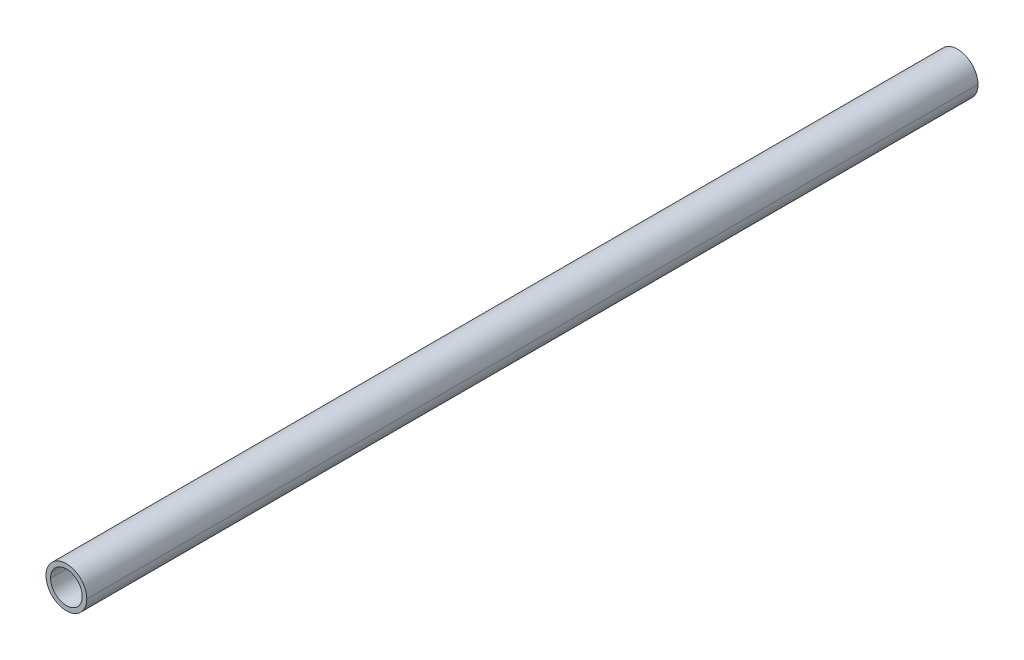
ISO-10303-21;
HEADER;
FILE_DESCRIPTION(('STEP AP214'),'2;1');
FILE_NAME('part.step','',(''),(''),'','','');
FILE_SCHEMA(('AUTOMOTIVE_DESIGN { 1 0 10303 214 1 1 1 1 }'));
ENDSEC;
DATA;
#1=APPLICATION_CONTEXT('core data for automotive mechanical design processes');
#2=APPLICATION_PROTOCOL_DEFINITION('international standard','automotive_design',2000,#1);
#3=PRODUCT_CONTEXT('',#1,'mechanical');
#4=PRODUCT('Part','Part','',(#3));
#5=PRODUCT_RELATED_PRODUCT_CATEGORY('part','',(#4));
#6=PRODUCT_DEFINITION_FORMATION('','',#4);
#7=PRODUCT_DEFINITION_CONTEXT('part definition',#1,'design');
#8=PRODUCT_DEFINITION('design','',#6,#7);
#9=PRODUCT_DEFINITION_SHAPE('','',#8);
#10=(LENGTH_UNIT() NAMED_UNIT(*) SI_UNIT(.MILLI.,.METRE.));
#11=(NAMED_UNIT(*) PLANE_ANGLE_UNIT() SI_UNIT($,.RADIAN.));
#12=(NAMED_UNIT(*) SI_UNIT($,.STERADIAN.) SOLID_ANGLE_UNIT());
#13=UNCERTAINTY_MEASURE_WITH_UNIT(LENGTH_MEASURE(1.E-05),#10,'distance_accuracy_value','');
#14=(GEOMETRIC_REPRESENTATION_CONTEXT(3) GLOBAL_UNCERTAINTY_ASSIGNED_CONTEXT((#13)) GLOBAL_UNIT_ASSIGNED_CONTEXT((#10,
#11,#12)) REPRESENTATION_CONTEXT('',''));
#15=CARTESIAN_POINT('',(0.,0.,0.));
#16=DIRECTION('',(0.,0.,1.));
#17=DIRECTION('',(1.,0.,0.));
#18=AXIS2_PLACEMENT_3D('',#15,#16,#17);
#19=CARTESIAN_POINT('',(0.,0.,393.37));
#20=DIRECTION('',(0.,0.,-1.));
#21=DIRECTION('',(-1.,0.,0.));
#22=AXIS2_PLACEMENT_3D('',#19,#20,#21);
#23=CYLINDRICAL_SURFACE('',#22,7.);
#24=DIRECTION('',(0.,0.,-1.));
#25=VECTOR('',#24,1.);
#26=CARTESIAN_POINT('',(7.,0.,393.37));
#27=LINE('',#26,#25);
#28=CARTESIAN_POINT('',(7.,0.,393.37));
#29=VERTEX_POINT('',#28);
#30=CARTESIAN_POINT('',(7.,0.,0.));
#31=VERTEX_POINT('',#30);
#32=EDGE_CURVE('E103',#29,#31,#27,.T.);
#33=ORIENTED_EDGE('',*,*,#32,.F.);
#34=CARTESIAN_POINT('',(0.,0.,393.37));
#35=DIRECTION('',(0.,0.,1.));
#36=DIRECTION('',(1.,0.,0.));
#37=AXIS2_PLACEMENT_3D('',#34,#35,#36);
#38=CIRCLE('',#37,7.);
#39=CARTESIAN_POINT('',(-7.,0.,393.37));
#40=VERTEX_POINT('',#39);
#41=EDGE_CURVE('E67',#29,#40,#38,.T.);
#42=ORIENTED_EDGE('',*,*,#41,.T.);
#43=DIRECTION('',(0.,0.,-1.));
#44=VECTOR('',#43,1.);
#45=CARTESIAN_POINT('',(-7.,0.,393.37));
#46=LINE('',#45,#44);
#47=CARTESIAN_POINT('',(-7.,0.,0.));
#48=VERTEX_POINT('',#47);
#49=EDGE_CURVE('E76',#40,#48,#46,.T.);
#50=ORIENTED_EDGE('',*,*,#49,.T.);
#51=CARTESIAN_POINT('',(0.,0.,0.));
#52=DIRECTION('',(0.,0.,1.));
#53=DIRECTION('',(1.,0.,0.));
#54=AXIS2_PLACEMENT_3D('',#51,#52,#53);
#55=CIRCLE('',#54,7.);
#56=EDGE_CURVE('E11',#31,#48,#55,.T.);
#57=ORIENTED_EDGE('',*,*,#56,.F.);
#58=EDGE_LOOP('',(#33,#42,#50,#57));
#59=FACE_BOUND('',#58,.T.);
#60=ADVANCED_FACE('F16',(#59),#23,.F.);
#61=CARTESIAN_POINT('',(0.,0.,393.37));
#62=DIRECTION('',(0.,0.,-1.));
#63=DIRECTION('',(-1.,0.,0.));
#64=AXIS2_PLACEMENT_3D('',#61,#62,#63);
#65=CYLINDRICAL_SURFACE('',#64,9.);
#66=DIRECTION('',(0.,0.,-1.));
#67=VECTOR('',#66,1.);
#68=CARTESIAN_POINT('',(9.,0.,393.37));
#69=LINE('',#68,#67);
#70=CARTESIAN_POINT('',(9.,0.,393.37));
#71=VERTEX_POINT('',#70);
#72=CARTESIAN_POINT('',(9.,0.,0.));
#73=VERTEX_POINT('',#72);
#74=EDGE_CURVE('E62',#71,#73,#69,.T.);
#75=ORIENTED_EDGE('',*,*,#74,.F.);
#76=CARTESIAN_POINT('',(0.,0.,393.37));
#77=DIRECTION('',(0.,0.,1.));
#78=DIRECTION('',(1.,0.,0.));
#79=AXIS2_PLACEMENT_3D('',#76,#77,#78);
#80=CIRCLE('',#79,9.);
#81=CARTESIAN_POINT('',(-9.,0.,393.37));
#82=VERTEX_POINT('',#81);
#83=EDGE_CURVE('E56',#82,#71,#80,.T.);
#84=ORIENTED_EDGE('',*,*,#83,.F.);
#85=DIRECTION('',(0.,0.,-1.));
#86=VECTOR('',#85,1.);
#87=CARTESIAN_POINT('',(-9.,0.,393.37));
#88=LINE('',#87,#86);
#89=CARTESIAN_POINT('',(-9.,0.,0.));
#90=VERTEX_POINT('',#89);
#91=EDGE_CURVE('E59',#82,#90,#88,.T.);
#92=ORIENTED_EDGE('',*,*,#91,.T.);
#93=CARTESIAN_POINT('',(0.,0.,0.));
#94=DIRECTION('',(0.,0.,1.));
#95=DIRECTION('',(1.,0.,0.));
#96=AXIS2_PLACEMENT_3D('',#93,#94,#95);
#97=CIRCLE('',#96,9.);
#98=EDGE_CURVE('E26',#90,#73,#97,.T.);
#99=ORIENTED_EDGE('',*,*,#98,.T.);
#100=EDGE_LOOP('',(#75,#84,#92,#99));
#101=FACE_BOUND('',#100,.T.);
#102=ADVANCED_FACE('F58',(#101),#65,.T.);
#103=CARTESIAN_POINT('',(0.,0.,0.));
#104=DIRECTION('',(0.,0.,1.));
#105=DIRECTION('',(1.,0.,0.));
#106=AXIS2_PLACEMENT_3D('',#103,#104,#105);
#107=PLANE('',#106);
#108=CARTESIAN_POINT('',(0.,0.,0.));
#109=DIRECTION('',(0.,0.,1.));
#110=DIRECTION('',(1.,0.,0.));
#111=AXIS2_PLACEMENT_3D('',#108,#109,#110);
#112=CIRCLE('',#111,7.);
#113=EDGE_CURVE('E84',#48,#31,#112,.T.);
#114=ORIENTED_EDGE('',*,*,#113,.T.);
#115=ORIENTED_EDGE('',*,*,#56,.T.);
#116=EDGE_LOOP('',(#114,#115));
#117=FACE_BOUND('',#116,.T.);
#118=ORIENTED_EDGE('',*,*,#98,.F.);
#119=CARTESIAN_POINT('',(0.,0.,0.));
#120=DIRECTION('',(0.,0.,1.));
#121=DIRECTION('',(1.,0.,0.));
#122=AXIS2_PLACEMENT_3D('',#119,#120,#121);
#123=CIRCLE('',#122,9.);
#124=EDGE_CURVE('E71',#73,#90,#123,.T.);
#125=ORIENTED_EDGE('',*,*,#124,.F.);
#126=EDGE_LOOP('',(#118,#125));
#127=FACE_BOUND('',#126,.T.);
#128=ADVANCED_FACE('F123',(#117,#127),#107,.F.);
#129=CARTESIAN_POINT('',(0.,0.,393.37));
#130=DIRECTION('',(0.,0.,1.));
#131=DIRECTION('',(1.,0.,0.));
#132=AXIS2_PLACEMENT_3D('',#129,#130,#131);
#133=PLANE('',#132);
#134=CARTESIAN_POINT('',(0.,0.,393.37));
#135=DIRECTION('',(0.,0.,1.));
#136=DIRECTION('',(1.,0.,0.));
#137=AXIS2_PLACEMENT_3D('',#134,#135,#136);
#138=CIRCLE('',#137,7.);
#139=EDGE_CURVE('E107',#40,#29,#138,.T.);
#140=ORIENTED_EDGE('',*,*,#139,.F.);
#141=ORIENTED_EDGE('',*,*,#41,.F.);
#142=EDGE_LOOP('',(#140,#141));
#143=FACE_BOUND('',#142,.T.);
#144=ORIENTED_EDGE('',*,*,#83,.T.);
#145=CARTESIAN_POINT('',(0.,0.,393.37));
#146=DIRECTION('',(0.,0.,1.));
#147=DIRECTION('',(1.,0.,0.));
#148=AXIS2_PLACEMENT_3D('',#145,#146,#147);
#149=CIRCLE('',#148,9.);
#150=EDGE_CURVE('E70',#71,#82,#149,.T.);
#151=ORIENTED_EDGE('',*,*,#150,.T.);
#152=EDGE_LOOP('',(#144,#151));
#153=FACE_BOUND('',#152,.T.);
#154=ADVANCED_FACE('F74',(#143,#153),#133,.T.);
#155=CARTESIAN_POINT('',(0.,0.,393.37));
#156=DIRECTION('',(0.,0.,-1.));
#157=DIRECTION('',(-1.,0.,0.));
#158=AXIS2_PLACEMENT_3D('',#155,#156,#157);
#159=CYLINDRICAL_SURFACE('',#158,9.);
#160=ORIENTED_EDGE('',*,*,#150,.F.);
#161=ORIENTED_EDGE('',*,*,#74,.T.);
#162=ORIENTED_EDGE('',*,*,#124,.T.);
#163=ORIENTED_EDGE('',*,*,#91,.F.);
#164=EDGE_LOOP('',(#160,#161,#162,#163));
#165=FACE_BOUND('',#164,.T.);
#166=ADVANCED_FACE('F18',(#165),#159,.T.);
#167=CARTESIAN_POINT('',(0.,0.,393.37));
#168=DIRECTION('',(0.,0.,-1.));
#169=DIRECTION('',(-1.,0.,0.));
#170=AXIS2_PLACEMENT_3D('',#167,#168,#169);
#171=CYLINDRICAL_SURFACE('',#170,7.);
#172=ORIENTED_EDGE('',*,*,#139,.T.);
#173=ORIENTED_EDGE('',*,*,#32,.T.);
#174=ORIENTED_EDGE('',*,*,#113,.F.);
#175=ORIENTED_EDGE('',*,*,#49,.F.);
#176=EDGE_LOOP('',(#172,#173,#174,#175));
#177=FACE_BOUND('',#176,.T.);
#178=ADVANCED_FACE('F125',(#177),#171,.F.);
#179=CLOSED_SHELL('',(#60,#102,#128,#154,#166,#178));
#180=MANIFOLD_SOLID_BREP('B1',#179);
#181=ADVANCED_BREP_SHAPE_REPRESENTATION('',(#18,#180),#14);
#182=SHAPE_DEFINITION_REPRESENTATION(#9,#181);
ENDSEC;
END-ISO-10303-21;
